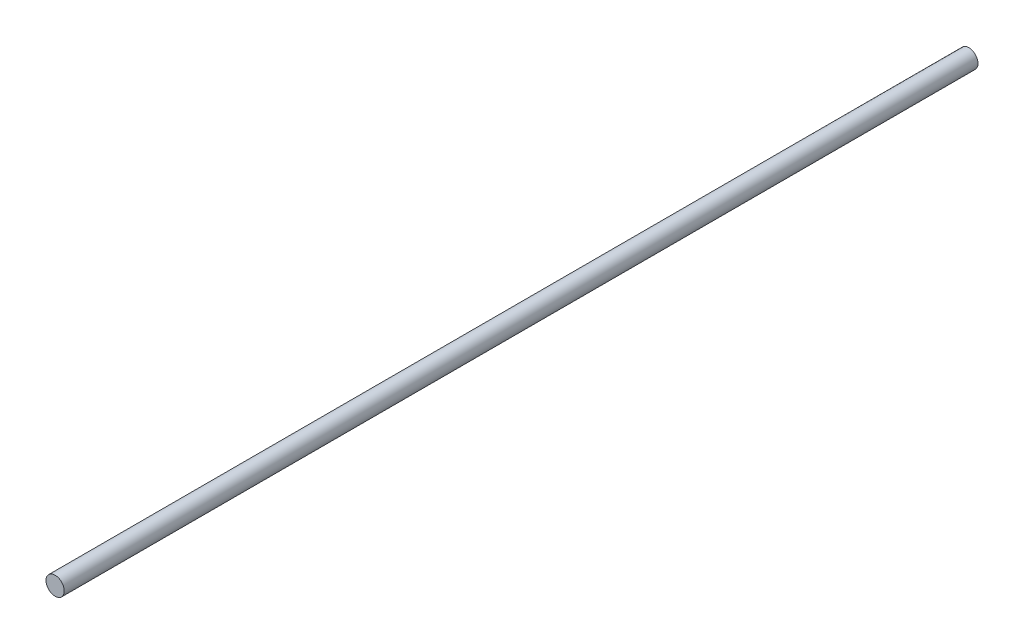
ISO-10303-21;
HEADER;
FILE_DESCRIPTION(('STEP AP214'),'2;1');
FILE_NAME('part.step','',(''),(''),'','','');
FILE_SCHEMA(('AUTOMOTIVE_DESIGN { 1 0 10303 214 1 1 1 1 }'));
ENDSEC;
DATA;
#1=APPLICATION_CONTEXT('core data for automotive mechanical design processes');
#2=APPLICATION_PROTOCOL_DEFINITION('international standard','automotive_design',2000,#1);
#3=PRODUCT_CONTEXT('',#1,'mechanical');
#4=PRODUCT('Part','Part','',(#3));
#5=PRODUCT_RELATED_PRODUCT_CATEGORY('part','',(#4));
#6=PRODUCT_DEFINITION_FORMATION('','',#4);
#7=PRODUCT_DEFINITION_CONTEXT('part definition',#1,'design');
#8=PRODUCT_DEFINITION('design','',#6,#7);
#9=PRODUCT_DEFINITION_SHAPE('','',#8);
#10=(LENGTH_UNIT() NAMED_UNIT(*) SI_UNIT(.MILLI.,.METRE.));
#11=(NAMED_UNIT(*) PLANE_ANGLE_UNIT() SI_UNIT($,.RADIAN.));
#12=(NAMED_UNIT(*) SI_UNIT($,.STERADIAN.) SOLID_ANGLE_UNIT());
#13=UNCERTAINTY_MEASURE_WITH_UNIT(LENGTH_MEASURE(1.E-05),#10,'distance_accuracy_value','');
#14=(GEOMETRIC_REPRESENTATION_CONTEXT(3) GLOBAL_UNCERTAINTY_ASSIGNED_CONTEXT((#13)) GLOBAL_UNIT_ASSIGNED_CONTEXT((#10,
#11,#12)) REPRESENTATION_CONTEXT('',''));
#15=CARTESIAN_POINT('',(0.,0.,0.));
#16=DIRECTION('',(0.,0.,1.));
#17=DIRECTION('',(1.,0.,0.));
#18=AXIS2_PLACEMENT_3D('',#15,#16,#17);
#19=CARTESIAN_POINT('',(0.,0.,500.));
#20=DIRECTION('',(0.,0.,-1.));
#21=DIRECTION('',(-1.,0.,0.));
#22=AXIS2_PLACEMENT_3D('',#19,#20,#21);
#23=CYLINDRICAL_SURFACE('',#22,10.);
#24=CARTESIAN_POINT('',(0.,0.,500.));
#25=DIRECTION('',(0.,0.,1.));
#26=DIRECTION('',(1.,0.,0.));
#27=AXIS2_PLACEMENT_3D('',#24,#25,#26);
#28=CIRCLE('',#27,10.);
#29=CARTESIAN_POINT('',(10.,0.,500.));
#30=VERTEX_POINT('',#29);
#31=EDGE_CURVE('E10',#30,#30,#28,.T.);
#32=ORIENTED_EDGE('',*,*,#31,.F.);
#33=EDGE_LOOP('',(#32));
#34=FACE_BOUND('',#33,.T.);
#35=CARTESIAN_POINT('',(0.,0.,-500.));
#36=DIRECTION('',(0.,0.,1.));
#37=DIRECTION('',(1.,0.,0.));
#38=AXIS2_PLACEMENT_3D('',#35,#36,#37);
#39=CIRCLE('',#38,10.);
#40=CARTESIAN_POINT('',(10.,0.,-500.));
#41=VERTEX_POINT('',#40);
#42=EDGE_CURVE('E42',#41,#41,#39,.T.);
#43=ORIENTED_EDGE('',*,*,#42,.T.);
#44=EDGE_LOOP('',(#43));
#45=FACE_BOUND('',#44,.T.);
#46=ADVANCED_FACE('F39',(#34,#45),#23,.T.);
#47=CARTESIAN_POINT('',(0.,0.,500.));
#48=DIRECTION('',(0.,0.,1.));
#49=DIRECTION('',(1.,0.,0.));
#50=AXIS2_PLACEMENT_3D('',#47,#48,#49);
#51=PLANE('',#50);
#52=ORIENTED_EDGE('',*,*,#31,.T.);
#53=EDGE_LOOP('',(#52));
#54=FACE_BOUND('',#53,.T.);
#55=ADVANCED_FACE('F56',(#54),#51,.T.);
#56=CARTESIAN_POINT('',(0.,0.,-500.));
#57=DIRECTION('',(0.,0.,1.));
#58=DIRECTION('',(1.,0.,0.));
#59=AXIS2_PLACEMENT_3D('',#56,#57,#58);
#60=PLANE('',#59);
#61=ORIENTED_EDGE('',*,*,#42,.F.);
#62=EDGE_LOOP('',(#61));
#63=FACE_BOUND('',#62,.T.);
#64=ADVANCED_FACE('F54',(#63),#60,.F.);
#65=CLOSED_SHELL('',(#46,#55,#64));
#66=MANIFOLD_SOLID_BREP('B2',#65);
#67=ADVANCED_BREP_SHAPE_REPRESENTATION('',(#18,#66),#14);
#68=SHAPE_DEFINITION_REPRESENTATION(#9,#67);
ENDSEC;
END-ISO-10303-21;
